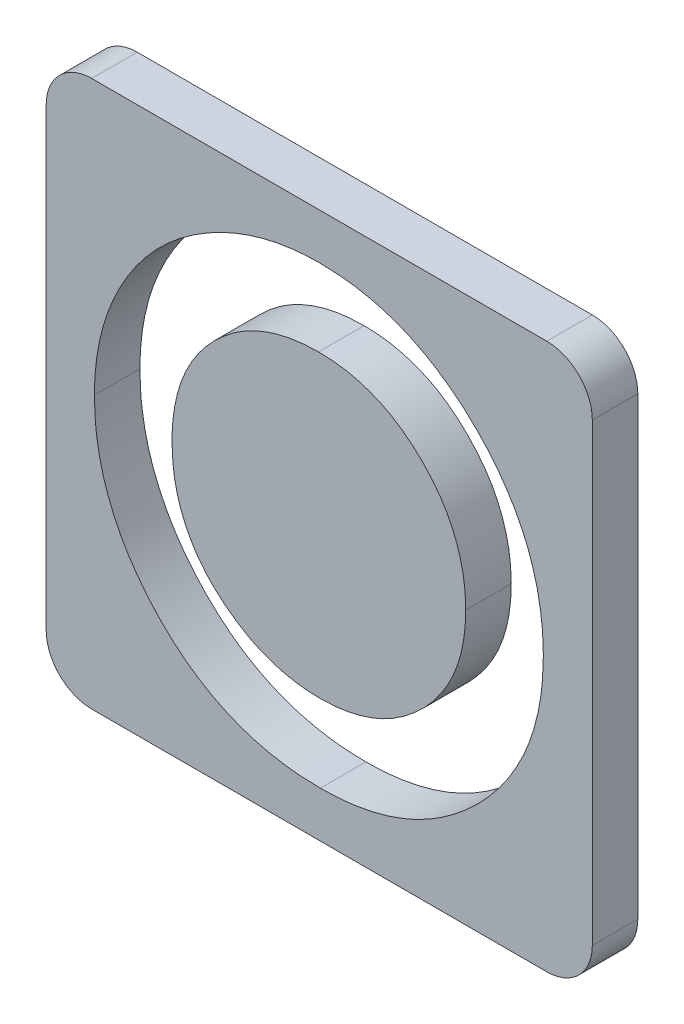
ISO-10303-21;
HEADER;
FILE_DESCRIPTION(('STEP AP214'),'2;1');
FILE_NAME('part.step','',(''),(''),'','','');
FILE_SCHEMA(('AUTOMOTIVE_DESIGN { 1 0 10303 214 1 1 1 1 }'));
ENDSEC;
DATA;
#1=APPLICATION_CONTEXT('core data for automotive mechanical design processes');
#2=APPLICATION_PROTOCOL_DEFINITION('international standard','automotive_design',2000,#1);
#3=PRODUCT_CONTEXT('',#1,'mechanical');
#4=PRODUCT('Part','Part','',(#3));
#5=PRODUCT_RELATED_PRODUCT_CATEGORY('part','',(#4));
#6=PRODUCT_DEFINITION_FORMATION('','',#4);
#7=PRODUCT_DEFINITION_CONTEXT('part definition',#1,'design');
#8=PRODUCT_DEFINITION('design','',#6,#7);
#9=PRODUCT_DEFINITION_SHAPE('','',#8);
#10=(LENGTH_UNIT() NAMED_UNIT(*) SI_UNIT(.MILLI.,.METRE.));
#11=(NAMED_UNIT(*) PLANE_ANGLE_UNIT() SI_UNIT($,.RADIAN.));
#12=(NAMED_UNIT(*) SI_UNIT($,.STERADIAN.) SOLID_ANGLE_UNIT());
#13=UNCERTAINTY_MEASURE_WITH_UNIT(LENGTH_MEASURE(1.E-05),#10,'distance_accuracy_value','');
#14=(GEOMETRIC_REPRESENTATION_CONTEXT(3) GLOBAL_UNCERTAINTY_ASSIGNED_CONTEXT((#13)) GLOBAL_UNIT_ASSIGNED_CONTEXT((#10,
#11,#12)) REPRESENTATION_CONTEXT('',''));
#15=CARTESIAN_POINT('',(0.,0.,0.));
#16=DIRECTION('',(0.,0.,1.));
#17=DIRECTION('',(1.,0.,0.));
#18=AXIS2_PLACEMENT_3D('',#15,#16,#17);
#19=CARTESIAN_POINT('',(50.,50.,10.));
#20=DIRECTION('',(0.,0.,-1.));
#21=DIRECTION('',(-1.,0.,0.));
#22=AXIS2_PLACEMENT_3D('',#19,#20,#21);
#23=PLANE('',#22);
#24=DIRECTION('',(1.,0.,0.));
#25=VECTOR('',#24,1.);
#26=CARTESIAN_POINT('',(-49.9999999999999,60.,10.));
#27=LINE('',#26,#25);
#28=CARTESIAN_POINT('',(-49.9999999999999,60.,10.));
#29=VERTEX_POINT('',#28);
#30=CARTESIAN_POINT('',(49.9999999999999,60.,10.));
#31=VERTEX_POINT('',#30);
#32=EDGE_CURVE('E264',#29,#31,#27,.T.);
#33=ORIENTED_EDGE('',*,*,#32,.F.);
#34=CARTESIAN_POINT('',(-50.,50.,10.));
#35=DIRECTION('',(0.,0.,1.));
#36=DIRECTION('',(1.,0.,0.));
#37=AXIS2_PLACEMENT_3D('',#34,#35,#36);
#38=CIRCLE('',#37,10.);
#39=CARTESIAN_POINT('',(-60.,49.9999999999999,10.));
#40=VERTEX_POINT('',#39);
#41=EDGE_CURVE('E269',#29,#40,#38,.T.);
#42=ORIENTED_EDGE('',*,*,#41,.T.);
#43=DIRECTION('',(0.,-1.,0.));
#44=VECTOR('',#43,1.);
#45=CARTESIAN_POINT('',(-60.,49.9999999999999,10.));
#46=LINE('',#45,#44);
#47=CARTESIAN_POINT('',(-60.,-49.9999999999999,10.));
#48=VERTEX_POINT('',#47);
#49=EDGE_CURVE('E271',#40,#48,#46,.T.);
#50=ORIENTED_EDGE('',*,*,#49,.T.);
#51=CARTESIAN_POINT('',(-50.,-50.,10.));
#52=DIRECTION('',(0.,0.,1.));
#53=DIRECTION('',(1.,0.,0.));
#54=AXIS2_PLACEMENT_3D('',#51,#52,#53);
#55=CIRCLE('',#54,10.);
#56=CARTESIAN_POINT('',(-49.9999999999999,-60.,10.));
#57=VERTEX_POINT('',#56);
#58=EDGE_CURVE('E273',#48,#57,#55,.T.);
#59=ORIENTED_EDGE('',*,*,#58,.T.);
#60=DIRECTION('',(1.,0.,0.));
#61=VECTOR('',#60,1.);
#62=CARTESIAN_POINT('',(-49.9999999999999,-60.,10.));
#63=LINE('',#62,#61);
#64=CARTESIAN_POINT('',(49.9999999999999,-60.,10.));
#65=VERTEX_POINT('',#64);
#66=EDGE_CURVE('E275',#57,#65,#63,.T.);
#67=ORIENTED_EDGE('',*,*,#66,.T.);
#68=CARTESIAN_POINT('',(50.,-50.,10.));
#69=DIRECTION('',(0.,0.,1.));
#70=DIRECTION('',(1.,0.,0.));
#71=AXIS2_PLACEMENT_3D('',#68,#69,#70);
#72=CIRCLE('',#71,10.);
#73=CARTESIAN_POINT('',(60.,-50.,10.));
#74=VERTEX_POINT('',#73);
#75=EDGE_CURVE('E175',#65,#74,#72,.T.);
#76=ORIENTED_EDGE('',*,*,#75,.T.);
#77=DIRECTION('',(0.,-1.,0.));
#78=VECTOR('',#77,1.);
#79=CARTESIAN_POINT('',(60.,49.9999999999999,10.));
#80=LINE('',#79,#78);
#81=CARTESIAN_POINT('',(60.,49.9999999999999,10.));
#82=VERTEX_POINT('',#81);
#83=EDGE_CURVE('E278',#82,#74,#80,.T.);
#84=ORIENTED_EDGE('',*,*,#83,.F.);
#85=CARTESIAN_POINT('',(50.,50.,10.));
#86=DIRECTION('',(0.,0.,-1.));
#87=DIRECTION('',(-1.,0.,0.));
#88=AXIS2_PLACEMENT_3D('',#85,#86,#87);
#89=CIRCLE('',#88,10.);
#90=EDGE_CURVE('E283',#31,#82,#89,.T.);
#91=ORIENTED_EDGE('',*,*,#90,.F.);
#92=EDGE_LOOP('',(#33,#42,#50,#59,#67,#76,#84,#91));
#93=FACE_BOUND('',#92,.T.);
#94=CARTESIAN_POINT('',(-49.4102564102564,0.0380608974358959,10.));
#95=CARTESIAN_POINT('',(-49.3957673905878,1.1617685469443,10.));
#96=CARTESIAN_POINT('',(-49.3669728154704,3.39495512987123,10.));
#97=CARTESIAN_POINT('',(-49.0201118263977,6.70442365191481,10.));
#98=CARTESIAN_POINT('',(-48.5207317275487,9.94929579175007,10.));
#99=CARTESIAN_POINT('',(-47.7821722565631,13.1166341969936,10.));
#100=CARTESIAN_POINT('',(-46.8850112673752,16.2287829672669,10.));
#101=CARTESIAN_POINT('',(-45.722612472409,19.2567734509904,10.));
#102=CARTESIAN_POINT('',(-44.3994880710342,22.2329529137583,10.));
#103=CARTESIAN_POINT('',(-42.8535417852491,25.1221689493868,10.));
#104=CARTESIAN_POINT('',(-41.1345989954782,27.8978383560074,10.));
#105=CARTESIAN_POINT('',(-39.2590793696147,30.5468678164809,10.));
#106=CARTESIAN_POINT('',(-37.2222669390619,33.0372266921079,10.));
#107=CARTESIAN_POINT('',(-35.0307229514111,35.3852805957061,10.));
#108=CARTESIAN_POINT('',(-32.6768950493374,37.5755955985026,10.));
#109=CARTESIAN_POINT('',(-30.1917454075254,39.6391786588103,10.));
#110=CARTESIAN_POINT('',(-27.5270765932554,41.5212136730233,10.));
#111=CARTESIAN_POINT('',(-24.7412098463414,43.2676636898961,10.));
#112=CARTESIAN_POINT('',(-21.8498512428264,44.846948152451,10.));
#113=CARTESIAN_POINT('',(-18.8647712349628,46.1911878553042,9.99999999999999));
#114=CARTESIAN_POINT('',(-15.8474683677357,47.3650894910034,10.));
#115=CARTESIAN_POINT('',(-12.7576355441757,48.2915845676623,10.));
#116=CARTESIAN_POINT('',(-9.62838581927368,49.046205114471,10.));
#117=CARTESIAN_POINT('',(-6.42628949849059,49.5452486313514,10.));
#118=CARTESIAN_POINT('',(-3.18027570171302,49.8921000148372,10.));
#119=CARTESIAN_POINT('',(-0.991378229263571,49.9212636488662,10.));
#120=CARTESIAN_POINT('',(0.106971153846155,49.9358974358974,10.));
#121=B_SPLINE_CURVE_WITH_KNOTS('',3,(#94,#95,#96,#97,#98,#99,#100,#101,#102,#103,#104,#105,#106,
#107,#108,#109,#110,#111,#112,#113,#114,#115,#116,#117,#118,#119,#120),.UNSPECIFIED.,.F.,.F.,(4,
1,1,1,1,1,1,1,1,1,1,1,1,1,1,1,1,1,1,1,1,1,1,1,4),(0.,0.0431143456619736,0.0856827648242091,
0.127594324163927,0.169058622560548,0.21043202882131,0.251811166463053,0.293443839798239,
0.335380853221825,0.377476605960794,0.418688490676827,0.459873033671199,0.500872904625315,
0.541872775579432,0.583211776867324,0.624763201734076,0.666987622382089,0.709369705894239,
0.751102651944858,0.792568380120221,0.833545108550258,0.874827422556526,0.916017723211067,
0.957859203976305,1.),.UNSPECIFIED.);
#122=CARTESIAN_POINT('',(-49.4102564102564,0.0380608974358959,10.));
#123=VERTEX_POINT('',#122);
#124=CARTESIAN_POINT('',(0.106971153846155,49.9358974358974,10.));
#125=VERTEX_POINT('',#124);
#126=EDGE_CURVE('E90',#123,#125,#121,.T.);
#127=ORIENTED_EDGE('',*,*,#126,.T.);
#128=CARTESIAN_POINT('',(0.106971153846155,49.9358974358974,10.));
#129=CARTESIAN_POINT('',(1.75866258223979,49.89313218698,10.));
#130=CARTESIAN_POINT('',(5.01947556295759,49.8087038994705,10.));
#131=CARTESIAN_POINT('',(9.81495475203649,49.1049282300409,10.));
#132=CARTESIAN_POINT('',(14.4362856316943,47.9582266725385,10.));
#133=CARTESIAN_POINT('',(18.8813784494052,46.3642285673853,10.));
#134=CARTESIAN_POINT('',(23.139103203726,44.2797603455363,10.));
#135=CARTESIAN_POINT('',(27.2244783154098,41.7639180487764,10.));
#136=CARTESIAN_POINT('',(31.1228701644353,38.769216661042,10.));
#137=CARTESIAN_POINT('',(34.7943311570669,35.3655176250855,10.));
#138=CARTESIAN_POINT('',(38.1874232758517,31.664143544938,10.));
#139=CARTESIAN_POINT('',(41.1275395785458,27.6789562951129,10.));
#140=CARTESIAN_POINT('',(43.6347628999377,23.5132160806287,10.));
#141=CARTESIAN_POINT('',(45.7127562966981,19.1557606791591,10.));
#142=CARTESIAN_POINT('',(47.295535047718,14.5764126340281,10.));
#143=CARTESIAN_POINT('',(48.4062363644552,9.79852056758408,10.));
#144=CARTESIAN_POINT('',(49.119806932273,4.82344374644431,10.));
#145=CARTESIAN_POINT('',(49.2018785266101,1.43609454170056,10.));
#146=CARTESIAN_POINT('',(49.2435897435897,-0.285456730769226,10.));
#147=B_SPLINE_CURVE_WITH_KNOTS('',3,(#128,#129,#130,#131,#132,#133,#134,#135,#136,#137,#138,
#139,#140,#141,#142,#143,#144,#145,#146),.UNSPECIFIED.,.F.,.F.,(4,1,1,1,1,1,1,1,1,1,1,1,1,1,1,1,
4),(0.,0.0633955966615904,0.125157266642421,0.185649466526253,0.245976679340815,
0.306108368657957,0.367350588089175,0.429902078279914,0.494539958183194,0.559372582694048,
0.622409685845737,0.684357425819475,0.74580660077221,0.807430275015915,0.869995516069782,
0.933927867719273,1.),.UNSPECIFIED.);
#148=CARTESIAN_POINT('',(49.2435897435897,-0.285456730769226,10.));
#149=VERTEX_POINT('',#148);
#150=EDGE_CURVE('E80',#125,#149,#147,.T.);
#151=ORIENTED_EDGE('',*,*,#150,.T.);
#152=CARTESIAN_POINT('',(49.2435897435897,-0.285456730769226,10.));
#153=CARTESIAN_POINT('',(49.1991691023123,-1.98761009659369,10.));
#154=CARTESIAN_POINT('',(49.1116368034948,-5.34175791539525,10.));
#155=CARTESIAN_POINT('',(48.435367438689,-10.2709874443335,10.));
#156=CARTESIAN_POINT('',(47.3059617725432,-14.9976983321195,10.));
#157=CARTESIAN_POINT('',(45.7500281911789,-19.5325895951509,10.));
#158=CARTESIAN_POINT('',(43.7097217384712,-23.8536957766879,10.));
#159=CARTESIAN_POINT('',(41.2513920018967,-27.9886065377063,10.));
#160=CARTESIAN_POINT('',(38.3101683329392,-31.8989489169845,10.));
#161=CARTESIAN_POINT('',(34.9933287096222,-35.5826244760669,10.));
#162=CARTESIAN_POINT('',(31.3417761309501,-38.9263504765429,10.));
#163=CARTESIAN_POINT('',(27.4742022743858,-41.8730032399916,10.));
#164=CARTESIAN_POINT('',(23.408465205639,-44.3698855927531,10.));
#165=CARTESIAN_POINT('',(19.1505158666614,-46.4158538417511,10.));
#166=CARTESIAN_POINT('',(14.6912232893291,-48.0036544513869,10.));
#167=CARTESIAN_POINT('',(10.0416024715523,-49.123963156587,10.));
#168=CARTESIAN_POINT('',(5.20194113037205,-49.8047973780126,10.));
#169=CARTESIAN_POINT('',(1.91073671987994,-49.891757925059,10.));
#170=CARTESIAN_POINT('',(0.240184294871798,-49.9358974358974,10.));
#171=B_SPLINE_CURVE_WITH_KNOTS('',3,(#152,#153,#154,#155,#156,#157,#158,#159,#160,#161,#162,
#163,#164,#165,#166,#167,#168,#169,#170),.UNSPECIFIED.,.F.,.F.,(4,1,1,1,1,1,1,1,1,1,1,1,1,1,1,1,
4),(0.,0.0657223151915616,0.129507930702584,0.191722102692161,0.253161124502089,
0.314315703735257,0.375951739772862,0.438619600823409,0.502972901892777,0.567128645724265,
0.629552289579674,0.690476782434874,0.751072338410829,0.811667894386783,0.872929355587391,
0.935501370715807,1.),.UNSPECIFIED.);
#172=CARTESIAN_POINT('',(0.240184294871798,-49.9358974358974,10.));
#173=VERTEX_POINT('',#172);
#174=EDGE_CURVE('E147',#149,#173,#171,.T.);
#175=ORIENTED_EDGE('',*,*,#174,.T.);
#176=CARTESIAN_POINT('',(0.240184294871798,-49.9358974358974,10.));
#177=CARTESIAN_POINT('',(-1.50701323401463,-49.8963021190555,10.));
#178=CARTESIAN_POINT('',(-4.94001755752694,-49.8185027336616,10.));
#179=CARTESIAN_POINT('',(-9.96423475322915,-49.078666096082,10.));
#180=CARTESIAN_POINT('',(-14.7778689555149,-47.9642136733102,10.));
#181=CARTESIAN_POINT('',(-19.3404828653858,-46.3009532187965,10.));
#182=CARTESIAN_POINT('',(-23.6985428056991,-44.2217377925862,10.));
#183=CARTESIAN_POINT('',(-27.8200288302264,-41.6610593381173,10.));
#184=CARTESIAN_POINT('',(-31.7035558493577,-38.6231495743,10.));
#185=CARTESIAN_POINT('',(-35.3268473154687,-35.1858104982212,10.));
#186=CARTESIAN_POINT('',(-38.6095581585327,-31.4246076267552,10.));
#187=CARTESIAN_POINT('',(-41.5071943836964,-27.451230332802,10.));
#188=CARTESIAN_POINT('',(-43.9514148185676,-23.2960317246603,9.99999999999999));
#189=CARTESIAN_POINT('',(-45.9423088924062,-18.9570670811899,10.));
#190=CARTESIAN_POINT('',(-47.5118498043688,-14.4613020116144,10.));
#191=CARTESIAN_POINT('',(-48.6189825861533,-9.78135600965341,10.));
#192=CARTESIAN_POINT('',(-49.2729923398744,-4.92845328489871,10.));
#193=CARTESIAN_POINT('',(-49.3640921010548,-1.63226474371458,10.));
#194=CARTESIAN_POINT('',(-49.4102564102564,0.0380608974358959,10.));
#195=B_SPLINE_CURVE_WITH_KNOTS('',3,(#176,#177,#178,#179,#180,#181,#182,#183,#184,#185,#186,
#187,#188,#189,#190,#191,#192,#193,#194),.UNSPECIFIED.,.F.,.F.,(4,1,1,1,1,1,1,1,1,1,1,1,1,1,1,1,
4),(0.,0.0667486513092664,0.131151976090176,0.193732197057096,0.255325543378599,
0.316388185777386,0.378026862906887,0.440405679205402,0.504557429324081,0.568658287362015,
0.63098617909001,0.692288134873299,0.752615446979639,0.813199538435563,0.874016124860782,
0.936158355510531,1.),.UNSPECIFIED.);
#196=EDGE_CURVE('E152',#173,#123,#195,.T.);
#197=ORIENTED_EDGE('',*,*,#196,.T.);
#198=EDGE_LOOP('',(#127,#151,#175,#197));
#199=FACE_BOUND('',#198,.T.);
#200=ADVANCED_FACE('F43',(#93,#199),#23,.F.);
#201=CARTESIAN_POINT('',(50.,50.,0.));
#202=DIRECTION('',(0.,0.,-1.));
#203=DIRECTION('',(-1.,0.,0.));
#204=AXIS2_PLACEMENT_3D('',#201,#202,#203);
#205=PLANE('',#204);
#206=DIRECTION('',(1.,0.,0.));
#207=VECTOR('',#206,1.);
#208=CARTESIAN_POINT('',(-49.9999999999999,60.,0.));
#209=LINE('',#208,#207);
#210=CARTESIAN_POINT('',(-49.9999999999999,60.,0.));
#211=VERTEX_POINT('',#210);
#212=CARTESIAN_POINT('',(49.9999999999999,60.,0.));
#213=VERTEX_POINT('',#212);
#214=EDGE_CURVE('E155',#211,#213,#209,.T.);
#215=ORIENTED_EDGE('',*,*,#214,.T.);
#216=CARTESIAN_POINT('',(50.,50.,0.));
#217=DIRECTION('',(0.,0.,-1.));
#218=DIRECTION('',(-1.,0.,0.));
#219=AXIS2_PLACEMENT_3D('',#216,#217,#218);
#220=CIRCLE('',#219,10.);
#221=CARTESIAN_POINT('',(60.,49.9999999999999,0.));
#222=VERTEX_POINT('',#221);
#223=EDGE_CURVE('E255',#213,#222,#220,.T.);
#224=ORIENTED_EDGE('',*,*,#223,.T.);
#225=DIRECTION('',(0.,-1.,0.));
#226=VECTOR('',#225,1.);
#227=CARTESIAN_POINT('',(60.,49.9999999999999,0.));
#228=LINE('',#227,#226);
#229=CARTESIAN_POINT('',(60.,-50.,0.));
#230=VERTEX_POINT('',#229);
#231=EDGE_CURVE('E262',#222,#230,#228,.T.);
#232=ORIENTED_EDGE('',*,*,#231,.T.);
#233=CARTESIAN_POINT('',(50.,-50.,0.));
#234=DIRECTION('',(0.,0.,1.));
#235=DIRECTION('',(1.,0.,0.));
#236=AXIS2_PLACEMENT_3D('',#233,#234,#235);
#237=CIRCLE('',#236,10.);
#238=CARTESIAN_POINT('',(49.9999999999999,-60.,0.));
#239=VERTEX_POINT('',#238);
#240=EDGE_CURVE('E296',#239,#230,#237,.T.);
#241=ORIENTED_EDGE('',*,*,#240,.F.);
#242=DIRECTION('',(1.,0.,0.));
#243=VECTOR('',#242,1.);
#244=CARTESIAN_POINT('',(-49.9999999999999,-60.,0.));
#245=LINE('',#244,#243);
#246=CARTESIAN_POINT('',(-49.9999999999999,-60.,0.));
#247=VERTEX_POINT('',#246);
#248=EDGE_CURVE('E300',#247,#239,#245,.T.);
#249=ORIENTED_EDGE('',*,*,#248,.F.);
#250=CARTESIAN_POINT('',(-50.,-50.,0.));
#251=DIRECTION('',(0.,0.,1.));
#252=DIRECTION('',(1.,0.,0.));
#253=AXIS2_PLACEMENT_3D('',#250,#251,#252);
#254=CIRCLE('',#253,10.);
#255=CARTESIAN_POINT('',(-60.,-49.9999999999999,0.));
#256=VERTEX_POINT('',#255);
#257=EDGE_CURVE('E304',#256,#247,#254,.T.);
#258=ORIENTED_EDGE('',*,*,#257,.F.);
#259=DIRECTION('',(0.,-1.,0.));
#260=VECTOR('',#259,1.);
#261=CARTESIAN_POINT('',(-60.,49.9999999999999,0.));
#262=LINE('',#261,#260);
#263=CARTESIAN_POINT('',(-60.,49.9999999999999,0.));
#264=VERTEX_POINT('',#263);
#265=EDGE_CURVE('E308',#264,#256,#262,.T.);
#266=ORIENTED_EDGE('',*,*,#265,.F.);
#267=CARTESIAN_POINT('',(-50.,50.,0.));
#268=DIRECTION('',(0.,0.,1.));
#269=DIRECTION('',(1.,0.,0.));
#270=AXIS2_PLACEMENT_3D('',#267,#268,#269);
#271=CIRCLE('',#270,10.);
#272=EDGE_CURVE('E287',#211,#264,#271,.T.);
#273=ORIENTED_EDGE('',*,*,#272,.F.);
#274=EDGE_LOOP('',(#215,#224,#232,#241,#249,#258,#266,#273));
#275=FACE_BOUND('',#274,.T.);
#276=CARTESIAN_POINT('',(0.106971153846155,49.9358974358974,0.));
#277=CARTESIAN_POINT('',(1.75866258223979,49.89313218698,0.));
#278=CARTESIAN_POINT('',(5.01947556295759,49.8087038994705,0.));
#279=CARTESIAN_POINT('',(9.81495475203649,49.1049282300409,0.));
#280=CARTESIAN_POINT('',(14.4362856316943,47.9582266725385,0.));
#281=CARTESIAN_POINT('',(18.8813784494052,46.3642285673853,0.));
#282=CARTESIAN_POINT('',(23.139103203726,44.2797603455363,0.));
#283=CARTESIAN_POINT('',(27.2244783154098,41.7639180487764,0.));
#284=CARTESIAN_POINT('',(31.1228701644353,38.769216661042,0.));
#285=CARTESIAN_POINT('',(34.7943311570669,35.3655176250855,0.));
#286=CARTESIAN_POINT('',(38.1874232758517,31.664143544938,0.));
#287=CARTESIAN_POINT('',(41.1275395785458,27.6789562951129,0.));
#288=CARTESIAN_POINT('',(43.6347628999377,23.5132160806287,0.));
#289=CARTESIAN_POINT('',(45.7127562966981,19.1557606791591,0.));
#290=CARTESIAN_POINT('',(47.295535047718,14.5764126340281,0.));
#291=CARTESIAN_POINT('',(48.4062363644552,9.79852056758408,0.));
#292=CARTESIAN_POINT('',(49.119806932273,4.82344374644431,0.));
#293=CARTESIAN_POINT('',(49.2018785266101,1.43609454170056,0.));
#294=CARTESIAN_POINT('',(49.2435897435897,-0.285456730769226,0.));
#295=B_SPLINE_CURVE_WITH_KNOTS('',3,(#276,#277,#278,#279,#280,#281,#282,#283,#284,#285,#286,
#287,#288,#289,#290,#291,#292,#293,#294),.UNSPECIFIED.,.F.,.F.,(4,1,1,1,1,1,1,1,1,1,1,1,1,1,1,1,
4),(0.,0.0633955966615904,0.125157266642421,0.185649466526253,0.245976679340815,
0.306108368657957,0.367350588089175,0.429902078279914,0.494539958183194,0.559372582694048,
0.622409685845737,0.684357425819475,0.74580660077221,0.807430275015915,0.869995516069782,
0.933927867719273,1.),.UNSPECIFIED.);
#296=CARTESIAN_POINT('',(0.106971153846155,49.9358974358974,0.));
#297=VERTEX_POINT('',#296);
#298=CARTESIAN_POINT('',(49.2435897435897,-0.285456730769226,0.));
#299=VERTEX_POINT('',#298);
#300=EDGE_CURVE('E76',#297,#299,#295,.T.);
#301=ORIENTED_EDGE('',*,*,#300,.F.);
#302=CARTESIAN_POINT('',(-49.4102564102564,0.0380608974358959,0.));
#303=CARTESIAN_POINT('',(-49.3957673905878,1.1617685469443,0.));
#304=CARTESIAN_POINT('',(-49.3669728154704,3.39495512987123,0.));
#305=CARTESIAN_POINT('',(-49.0201118263977,6.70442365191481,0.));
#306=CARTESIAN_POINT('',(-48.5207317275487,9.94929579175007,0.));
#307=CARTESIAN_POINT('',(-47.7821722565631,13.1166341969936,0.));
#308=CARTESIAN_POINT('',(-46.8850112673752,16.2287829672669,0.));
#309=CARTESIAN_POINT('',(-45.722612472409,19.2567734509904,0.));
#310=CARTESIAN_POINT('',(-44.3994880710342,22.2329529137583,0.));
#311=CARTESIAN_POINT('',(-42.8535417852491,25.1221689493868,0.));
#312=CARTESIAN_POINT('',(-41.1345989954782,27.8978383560074,0.));
#313=CARTESIAN_POINT('',(-39.2590793696147,30.5468678164809,0.));
#314=CARTESIAN_POINT('',(-37.2222669390619,33.0372266921079,0.));
#315=CARTESIAN_POINT('',(-35.0307229514111,35.3852805957061,0.));
#316=CARTESIAN_POINT('',(-32.6768950493374,37.5755955985026,0.));
#317=CARTESIAN_POINT('',(-30.1917454075254,39.6391786588103,0.));
#318=CARTESIAN_POINT('',(-27.5270765932554,41.5212136730233,0.));
#319=CARTESIAN_POINT('',(-24.7412098463414,43.2676636898961,0.));
#320=CARTESIAN_POINT('',(-21.8498512428264,44.846948152451,0.));
#321=CARTESIAN_POINT('',(-18.8647712349628,46.1911878553042,0.));
#322=CARTESIAN_POINT('',(-15.8474683677357,47.3650894910034,0.));
#323=CARTESIAN_POINT('',(-12.7576355441757,48.2915845676623,0.));
#324=CARTESIAN_POINT('',(-9.62838581927368,49.046205114471,0.));
#325=CARTESIAN_POINT('',(-6.42628949849059,49.5452486313514,0.));
#326=CARTESIAN_POINT('',(-3.18027570171302,49.8921000148372,0.));
#327=CARTESIAN_POINT('',(-0.991378229263571,49.9212636488662,0.));
#328=CARTESIAN_POINT('',(0.106971153846155,49.9358974358974,0.));
#329=B_SPLINE_CURVE_WITH_KNOTS('',3,(#302,#303,#304,#305,#306,#307,#308,#309,#310,#311,#312,
#313,#314,#315,#316,#317,#318,#319,#320,#321,#322,#323,#324,#325,#326,#327,#328),.UNSPECIFIED.,
.F.,.F.,(4,1,1,1,1,1,1,1,1,1,1,1,1,1,1,1,1,1,1,1,1,1,1,1,4),(0.,0.0431143456619736,
0.0856827648242091,0.127594324163927,0.169058622560548,0.21043202882131,0.251811166463053,
0.293443839798239,0.335380853221825,0.377476605960794,0.418688490676827,0.459873033671199,
0.500872904625315,0.541872775579432,0.583211776867324,0.624763201734076,0.666987622382089,
0.709369705894239,0.751102651944858,0.792568380120221,0.833545108550258,0.874827422556526,
0.916017723211067,0.957859203976305,1.),.UNSPECIFIED.);
#330=CARTESIAN_POINT('',(-49.4102564102564,0.0380608974358959,0.));
#331=VERTEX_POINT('',#330);
#332=EDGE_CURVE('E46',#331,#297,#329,.T.);
#333=ORIENTED_EDGE('',*,*,#332,.F.);
#334=CARTESIAN_POINT('',(0.240184294871798,-49.9358974358974,0.));
#335=CARTESIAN_POINT('',(-1.50701323401463,-49.8963021190555,0.));
#336=CARTESIAN_POINT('',(-4.94001755752694,-49.8185027336616,0.));
#337=CARTESIAN_POINT('',(-9.96423475322915,-49.078666096082,0.));
#338=CARTESIAN_POINT('',(-14.7778689555149,-47.9642136733102,0.));
#339=CARTESIAN_POINT('',(-19.3404828653858,-46.3009532187965,0.));
#340=CARTESIAN_POINT('',(-23.6985428056991,-44.2217377925862,0.));
#341=CARTESIAN_POINT('',(-27.8200288302264,-41.6610593381173,0.));
#342=CARTESIAN_POINT('',(-31.7035558493577,-38.6231495743,0.));
#343=CARTESIAN_POINT('',(-35.3268473154687,-35.1858104982212,0.));
#344=CARTESIAN_POINT('',(-38.6095581585327,-31.4246076267552,0.));
#345=CARTESIAN_POINT('',(-41.5071943836964,-27.451230332802,0.));
#346=CARTESIAN_POINT('',(-43.9514148185676,-23.2960317246603,0.));
#347=CARTESIAN_POINT('',(-45.9423088924062,-18.9570670811899,0.));
#348=CARTESIAN_POINT('',(-47.5118498043688,-14.4613020116144,0.));
#349=CARTESIAN_POINT('',(-48.6189825861533,-9.78135600965341,0.));
#350=CARTESIAN_POINT('',(-49.2729923398744,-4.92845328489871,0.));
#351=CARTESIAN_POINT('',(-49.3640921010548,-1.63226474371458,0.));
#352=CARTESIAN_POINT('',(-49.4102564102564,0.0380608974358959,0.));
#353=B_SPLINE_CURVE_WITH_KNOTS('',3,(#334,#335,#336,#337,#338,#339,#340,#341,#342,#343,#344,
#345,#346,#347,#348,#349,#350,#351,#352),.UNSPECIFIED.,.F.,.F.,(4,1,1,1,1,1,1,1,1,1,1,1,1,1,1,1,
4),(0.,0.0667486513092664,0.131151976090176,0.193732197057096,0.255325543378599,
0.316388185777386,0.378026862906887,0.440405679205402,0.504557429324081,0.568658287362015,
0.63098617909001,0.692288134873299,0.752615446979639,0.813199538435563,0.874016124860782,
0.936158355510531,1.),.UNSPECIFIED.);
#354=CARTESIAN_POINT('',(0.240184294871798,-49.9358974358974,0.));
#355=VERTEX_POINT('',#354);
#356=EDGE_CURVE('E55',#355,#331,#353,.T.);
#357=ORIENTED_EDGE('',*,*,#356,.F.);
#358=CARTESIAN_POINT('',(49.2435897435897,-0.285456730769226,0.));
#359=CARTESIAN_POINT('',(49.1991691023123,-1.98761009659369,0.));
#360=CARTESIAN_POINT('',(49.1116368034948,-5.34175791539525,0.));
#361=CARTESIAN_POINT('',(48.435367438689,-10.2709874443335,0.));
#362=CARTESIAN_POINT('',(47.3059617725432,-14.9976983321195,0.));
#363=CARTESIAN_POINT('',(45.7500281911789,-19.5325895951509,0.));
#364=CARTESIAN_POINT('',(43.7097217384712,-23.8536957766879,0.));
#365=CARTESIAN_POINT('',(41.2513920018967,-27.9886065377063,0.));
#366=CARTESIAN_POINT('',(38.3101683329392,-31.8989489169845,0.));
#367=CARTESIAN_POINT('',(34.9933287096222,-35.5826244760669,0.));
#368=CARTESIAN_POINT('',(31.3417761309501,-38.9263504765429,0.));
#369=CARTESIAN_POINT('',(27.4742022743858,-41.8730032399916,0.));
#370=CARTESIAN_POINT('',(23.408465205639,-44.3698855927531,0.));
#371=CARTESIAN_POINT('',(19.1505158666614,-46.4158538417511,0.));
#372=CARTESIAN_POINT('',(14.6912232893291,-48.0036544513869,0.));
#373=CARTESIAN_POINT('',(10.0416024715523,-49.123963156587,0.));
#374=CARTESIAN_POINT('',(5.20194113037205,-49.8047973780126,0.));
#375=CARTESIAN_POINT('',(1.91073671987994,-49.891757925059,0.));
#376=CARTESIAN_POINT('',(0.240184294871798,-49.9358974358974,0.));
#377=B_SPLINE_CURVE_WITH_KNOTS('',3,(#358,#359,#360,#361,#362,#363,#364,#365,#366,#367,#368,
#369,#370,#371,#372,#373,#374,#375,#376),.UNSPECIFIED.,.F.,.F.,(4,1,1,1,1,1,1,1,1,1,1,1,1,1,1,1,
4),(0.,0.0657223151915616,0.129507930702584,0.191722102692161,0.253161124502089,
0.314315703735257,0.375951739772862,0.438619600823409,0.502972901892777,0.567128645724265,
0.629552289579674,0.690476782434874,0.751072338410829,0.811667894386783,0.872929355587391,
0.935501370715807,1.),.UNSPECIFIED.);
#378=EDGE_CURVE('E149',#299,#355,#377,.T.);
#379=ORIENTED_EDGE('',*,*,#378,.F.);
#380=EDGE_LOOP('',(#301,#333,#357,#379));
#381=FACE_BOUND('',#380,.T.);
#382=ADVANCED_FACE('F193',(#275,#381),#205,.T.);
#383=CARTESIAN_POINT('',(-49.9999999999999,60.,10.));
#384=DIRECTION('',(0.,1.,0.));
#385=DIRECTION('',(0.,0.,1.));
#386=AXIS2_PLACEMENT_3D('',#383,#384,#385);
#387=PLANE('',#386);
#388=ORIENTED_EDGE('',*,*,#214,.F.);
#389=DIRECTION('',(0.,0.,-1.));
#390=VECTOR('',#389,1.);
#391=CARTESIAN_POINT('',(-49.9999999999999,60.,10.));
#392=LINE('',#391,#390);
#393=EDGE_CURVE('E289',#29,#211,#392,.T.);
#394=ORIENTED_EDGE('',*,*,#393,.F.);
#395=ORIENTED_EDGE('',*,*,#32,.T.);
#396=DIRECTION('',(0.,0.,-1.));
#397=VECTOR('',#396,1.);
#398=CARTESIAN_POINT('',(49.9999999999999,60.,10.));
#399=LINE('',#398,#397);
#400=EDGE_CURVE('E257',#31,#213,#399,.T.);
#401=ORIENTED_EDGE('',*,*,#400,.T.);
#402=EDGE_LOOP('',(#388,#394,#395,#401));
#403=FACE_BOUND('',#402,.T.);
#404=ADVANCED_FACE('F195',(#403),#387,.T.);
#405=CARTESIAN_POINT('',(-50.,50.,10.));
#406=DIRECTION('',(0.,0.,-1.));
#407=DIRECTION('',(-1.,0.,0.));
#408=AXIS2_PLACEMENT_3D('',#405,#406,#407);
#409=CYLINDRICAL_SURFACE('',#408,10.);
#410=ORIENTED_EDGE('',*,*,#272,.T.);
#411=DIRECTION('',(0.,0.,-1.));
#412=VECTOR('',#411,1.);
#413=CARTESIAN_POINT('',(-60.,49.9999999999999,10.));
#414=LINE('',#413,#412);
#415=EDGE_CURVE('E305',#40,#264,#414,.T.);
#416=ORIENTED_EDGE('',*,*,#415,.F.);
#417=ORIENTED_EDGE('',*,*,#41,.F.);
#418=ORIENTED_EDGE('',*,*,#393,.T.);
#419=EDGE_LOOP('',(#410,#416,#417,#418));
#420=FACE_BOUND('',#419,.T.);
#421=ADVANCED_FACE('F201',(#420),#409,.T.);
#422=CARTESIAN_POINT('',(-60.,49.9999999999999,10.));
#423=DIRECTION('',(1.,0.,0.));
#424=DIRECTION('',(0.,1.,0.));
#425=AXIS2_PLACEMENT_3D('',#422,#423,#424);
#426=PLANE('',#425);
#427=ORIENTED_EDGE('',*,*,#265,.T.);
#428=DIRECTION('',(0.,0.,-1.));
#429=VECTOR('',#428,1.);
#430=CARTESIAN_POINT('',(-60.,-49.9999999999999,10.));
#431=LINE('',#430,#429);
#432=EDGE_CURVE('E301',#48,#256,#431,.T.);
#433=ORIENTED_EDGE('',*,*,#432,.F.);
#434=ORIENTED_EDGE('',*,*,#49,.F.);
#435=ORIENTED_EDGE('',*,*,#415,.T.);
#436=EDGE_LOOP('',(#427,#433,#434,#435));
#437=FACE_BOUND('',#436,.T.);
#438=ADVANCED_FACE('F229',(#437),#426,.F.);
#439=CARTESIAN_POINT('',(-50.,-50.,10.));
#440=DIRECTION('',(0.,0.,-1.));
#441=DIRECTION('',(-1.,0.,0.));
#442=AXIS2_PLACEMENT_3D('',#439,#440,#441);
#443=CYLINDRICAL_SURFACE('',#442,10.);
#444=ORIENTED_EDGE('',*,*,#257,.T.);
#445=DIRECTION('',(0.,0.,-1.));
#446=VECTOR('',#445,1.);
#447=CARTESIAN_POINT('',(-49.9999999999999,-60.,10.));
#448=LINE('',#447,#446);
#449=EDGE_CURVE('E297',#57,#247,#448,.T.);
#450=ORIENTED_EDGE('',*,*,#449,.F.);
#451=ORIENTED_EDGE('',*,*,#58,.F.);
#452=ORIENTED_EDGE('',*,*,#432,.T.);
#453=EDGE_LOOP('',(#444,#450,#451,#452));
#454=FACE_BOUND('',#453,.T.);
#455=ADVANCED_FACE('F233',(#454),#443,.T.);
#456=CARTESIAN_POINT('',(-49.9999999999999,-60.,10.));
#457=DIRECTION('',(0.,1.,0.));
#458=DIRECTION('',(0.,0.,1.));
#459=AXIS2_PLACEMENT_3D('',#456,#457,#458);
#460=PLANE('',#459);
#461=ORIENTED_EDGE('',*,*,#248,.T.);
#462=DIRECTION('',(0.,0.,-1.));
#463=VECTOR('',#462,1.);
#464=CARTESIAN_POINT('',(49.9999999999999,-60.,10.));
#465=LINE('',#464,#463);
#466=EDGE_CURVE('E282',#65,#239,#465,.T.);
#467=ORIENTED_EDGE('',*,*,#466,.F.);
#468=ORIENTED_EDGE('',*,*,#66,.F.);
#469=ORIENTED_EDGE('',*,*,#449,.T.);
#470=EDGE_LOOP('',(#461,#467,#468,#469));
#471=FACE_BOUND('',#470,.T.);
#472=ADVANCED_FACE('F237',(#471),#460,.F.);
#473=CARTESIAN_POINT('',(50.,-50.,10.));
#474=DIRECTION('',(0.,0.,-1.));
#475=DIRECTION('',(-1.,0.,0.));
#476=AXIS2_PLACEMENT_3D('',#473,#474,#475);
#477=CYLINDRICAL_SURFACE('',#476,10.);
#478=ORIENTED_EDGE('',*,*,#240,.T.);
#479=DIRECTION('',(0.,0.,-1.));
#480=VECTOR('',#479,1.);
#481=CARTESIAN_POINT('',(60.,-50.,10.));
#482=LINE('',#481,#480);
#483=EDGE_CURVE('E281',#74,#230,#482,.T.);
#484=ORIENTED_EDGE('',*,*,#483,.F.);
#485=ORIENTED_EDGE('',*,*,#75,.F.);
#486=ORIENTED_EDGE('',*,*,#466,.T.);
#487=EDGE_LOOP('',(#478,#484,#485,#486));
#488=FACE_BOUND('',#487,.T.);
#489=ADVANCED_FACE('F241',(#488),#477,.T.);
#490=CARTESIAN_POINT('',(60.,49.9999999999999,10.));
#491=DIRECTION('',(1.,0.,0.));
#492=DIRECTION('',(0.,1.,0.));
#493=AXIS2_PLACEMENT_3D('',#490,#491,#492);
#494=PLANE('',#493);
#495=ORIENTED_EDGE('',*,*,#231,.F.);
#496=DIRECTION('',(0.,0.,-1.));
#497=VECTOR('',#496,1.);
#498=CARTESIAN_POINT('',(60.,49.9999999999999,10.));
#499=LINE('',#498,#497);
#500=EDGE_CURVE('E259',#82,#222,#499,.T.);
#501=ORIENTED_EDGE('',*,*,#500,.F.);
#502=ORIENTED_EDGE('',*,*,#83,.T.);
#503=ORIENTED_EDGE('',*,*,#483,.T.);
#504=EDGE_LOOP('',(#495,#501,#502,#503));
#505=FACE_BOUND('',#504,.T.);
#506=ADVANCED_FACE('F245',(#505),#494,.T.);
#507=CARTESIAN_POINT('',(50.,50.,10.));
#508=DIRECTION('',(0.,0.,-1.));
#509=DIRECTION('',(-1.,0.,0.));
#510=AXIS2_PLACEMENT_3D('',#507,#508,#509);
#511=CYLINDRICAL_SURFACE('',#510,10.);
#512=ORIENTED_EDGE('',*,*,#223,.F.);
#513=ORIENTED_EDGE('',*,*,#400,.F.);
#514=ORIENTED_EDGE('',*,*,#90,.T.);
#515=ORIENTED_EDGE('',*,*,#500,.T.);
#516=EDGE_LOOP('',(#512,#513,#514,#515));
#517=FACE_BOUND('',#516,.T.);
#518=ADVANCED_FACE('F226',(#517),#511,.T.);
#519=DIRECTION('',(0.,0.,1.));
#520=VECTOR('',#519,1.);
#521=SURFACE_OF_LINEAR_EXTRUSION('',#329,#520);
#522=ORIENTED_EDGE('',*,*,#126,.F.);
#523=DIRECTION('',(0.,0.,1.));
#524=VECTOR('',#523,1.);
#525=CARTESIAN_POINT('',(-49.4102564102564,0.0380608974358959,0.));
#526=LINE('',#525,#524);
#527=EDGE_CURVE('E12',#331,#123,#526,.T.);
#528=ORIENTED_EDGE('',*,*,#527,.F.);
#529=ORIENTED_EDGE('',*,*,#332,.T.);
#530=DIRECTION('',(0.,0.,1.));
#531=VECTOR('',#530,1.);
#532=CARTESIAN_POINT('',(0.106971153846155,49.9358974358974,0.));
#533=LINE('',#532,#531);
#534=EDGE_CURVE('E211',#297,#125,#533,.T.);
#535=ORIENTED_EDGE('',*,*,#534,.T.);
#536=EDGE_LOOP('',(#522,#528,#529,#535));
#537=FACE_BOUND('',#536,.T.);
#538=ADVANCED_FACE('F223',(#537),#521,.T.);
#539=DIRECTION('',(0.,0.,1.));
#540=VECTOR('',#539,1.);
#541=SURFACE_OF_LINEAR_EXTRUSION('',#295,#540);
#542=ORIENTED_EDGE('',*,*,#150,.F.);
#543=ORIENTED_EDGE('',*,*,#534,.F.);
#544=ORIENTED_EDGE('',*,*,#300,.T.);
#545=DIRECTION('',(0.,0.,1.));
#546=VECTOR('',#545,1.);
#547=CARTESIAN_POINT('',(49.2435897435897,-0.285456730769226,0.));
#548=LINE('',#547,#546);
#549=EDGE_CURVE('E210',#299,#149,#548,.T.);
#550=ORIENTED_EDGE('',*,*,#549,.T.);
#551=EDGE_LOOP('',(#542,#543,#544,#550));
#552=FACE_BOUND('',#551,.T.);
#553=ADVANCED_FACE('F220',(#552),#541,.T.);
#554=DIRECTION('',(0.,0.,1.));
#555=VECTOR('',#554,1.);
#556=SURFACE_OF_LINEAR_EXTRUSION('',#377,#555);
#557=ORIENTED_EDGE('',*,*,#174,.F.);
#558=ORIENTED_EDGE('',*,*,#549,.F.);
#559=ORIENTED_EDGE('',*,*,#378,.T.);
#560=DIRECTION('',(0.,0.,1.));
#561=VECTOR('',#560,1.);
#562=CARTESIAN_POINT('',(0.240184294871798,-49.9358974358974,0.));
#563=LINE('',#562,#561);
#564=EDGE_CURVE('E143',#355,#173,#563,.T.);
#565=ORIENTED_EDGE('',*,*,#564,.T.);
#566=EDGE_LOOP('',(#557,#558,#559,#565));
#567=FACE_BOUND('',#566,.T.);
#568=ADVANCED_FACE('F145',(#567),#556,.T.);
#569=DIRECTION('',(0.,0.,1.));
#570=VECTOR('',#569,1.);
#571=SURFACE_OF_LINEAR_EXTRUSION('',#353,#570);
#572=ORIENTED_EDGE('',*,*,#196,.F.);
#573=ORIENTED_EDGE('',*,*,#564,.F.);
#574=ORIENTED_EDGE('',*,*,#356,.T.);
#575=ORIENTED_EDGE('',*,*,#527,.T.);
#576=EDGE_LOOP('',(#572,#573,#574,#575));
#577=FACE_BOUND('',#576,.T.);
#578=ADVANCED_FACE('F153',(#577),#571,.T.);
#579=CLOSED_SHELL('',(#200,#382,#404,#421,#438,#455,#472,#489,#506,#518,#538,#553,#568,#578));
#580=MANIFOLD_SOLID_BREP('B2',#579);
#581=CARTESIAN_POINT('',(50.,50.,0.));
#582=DIRECTION('',(0.,0.,-1.));
#583=DIRECTION('',(-1.,0.,0.));
#584=AXIS2_PLACEMENT_3D('',#581,#582,#583);
#585=PLANE('',#584);
#586=CARTESIAN_POINT('',(-0.15945512820513,32.8846153846154,0.));
#587=CARTESIAN_POINT('',(-1.27104324113598,32.8547889797304,0.));
#588=CARTESIAN_POINT('',(-3.46487335841928,32.7959235919435,0.));
#589=CARTESIAN_POINT('',(-6.6828226086255,32.347448954538,0.));
#590=CARTESIAN_POINT('',(-9.77216753194014,31.6311839822079,0.));
#591=CARTESIAN_POINT('',(-12.7157826664063,30.593682922436,0.));
#592=CARTESIAN_POINT('',(-15.5264258966484,29.2732073921841,0.));
#593=CARTESIAN_POINT('',(-18.2090796223312,27.6743712929333,0.));
#594=CARTESIAN_POINT('',(-20.7265946351369,25.7422164227564,0.));
#595=CARTESIAN_POINT('',(-23.1125395644369,23.5804715608687,0.));
#596=CARTESIAN_POINT('',(-25.2678481950877,21.1717909852716,0.));
#597=CARTESIAN_POINT('',(-27.1721313636914,18.5904801093709,0.));
#598=CARTESIAN_POINT('',(-28.7657096571091,15.840849679504,0.));
#599=CARTESIAN_POINT('',(-30.1003414608288,12.9484431125689,0.));
#600=CARTESIAN_POINT('',(-31.1050234132349,9.88073606180563,0.));
#601=CARTESIAN_POINT('',(-31.8206282448904,6.66175820945336,0.));
#602=CARTESIAN_POINT('',(-32.2728637867414,3.28596309599323,0.));
#603=CARTESIAN_POINT('',(-32.3298686386258,0.984687961586383,0.));
#604=CARTESIAN_POINT('',(-32.3589743589744,-0.190304487179487,0.));
#605=B_SPLINE_CURVE_WITH_KNOTS('',3,(#586,#587,#588,#589,#590,#591,#592,#593,#594,#595,#596,
#597,#598,#599,#600,#601,#602,#603,#604),.UNSPECIFIED.,.F.,.F.,(4,1,1,1,1,1,1,1,1,1,1,1,1,1,1,1,
4),(0.,0.0646087354707741,0.127511789723675,0.188521308398647,0.24870817908937,
0.308598265178913,0.368812249109553,0.429887501815076,0.492802447924246,0.555743332102794,
0.617485294839564,0.678968963438038,0.740197691354554,0.802360101697609,0.866244776442732,
0.931706828395689,1.),.UNSPECIFIED.);
#606=CARTESIAN_POINT('',(-0.15945512820513,32.8846153846154,0.));
#607=VERTEX_POINT('',#606);
#608=CARTESIAN_POINT('',(-32.3589743589744,-0.190304487179487,0.));
#609=VERTEX_POINT('',#608);
#610=EDGE_CURVE('E484',#607,#609,#605,.T.);
#611=ORIENTED_EDGE('',*,*,#610,.F.);
#612=CARTESIAN_POINT('',(32.1923076923077,-0.0570913461538439,0.));
#613=CARTESIAN_POINT('',(32.1622540036208,1.07341445965001,0.));
#614=CARTESIAN_POINT('',(32.1030979009068,3.29864272575472,0.));
#615=CARTESIAN_POINT('',(31.6593646071988,6.56992141697626,0.));
#616=CARTESIAN_POINT('',(30.9144810776688,9.70437036545285,0.));
#617=CARTESIAN_POINT('',(29.8829931680828,12.7071084572865,0.));
#618=CARTESIAN_POINT('',(28.5658377289493,15.5810794903249,0.));
#619=CARTESIAN_POINT('',(26.937041406449,18.3161768836407,0.));
#620=CARTESIAN_POINT('',(25.0023194452483,20.9097564667928,0.));
#621=CARTESIAN_POINT('',(22.8061993511455,23.3441439867432,0.));
#622=CARTESIAN_POINT('',(20.4158576050688,25.5811901817063,0.));
#623=CARTESIAN_POINT('',(17.8495869002209,27.5225396249685,0.));
#624=CARTESIAN_POINT('',(15.1791943713752,29.209510566717,0.));
#625=CARTESIAN_POINT('',(12.3434081849674,30.5310154837322,0.));
#626=CARTESIAN_POINT('',(9.40024615256225,31.5838556478219,0.));
#627=CARTESIAN_POINT('',(6.33174894309361,32.3591822521189,0.));
#628=CARTESIAN_POINT('',(3.12629443545836,32.7927730357493,0.));
#629=CARTESIAN_POINT('',(0.945557455823347,32.8537283832547,0.));
#630=CARTESIAN_POINT('',(-0.15945512820513,32.8846153846154,0.));
#631=B_SPLINE_CURVE_WITH_KNOTS('',3,(#612,#613,#614,#615,#616,#617,#618,#619,#620,#621,#622,
#623,#624,#625,#626,#627,#628,#629,#630),.UNSPECIFIED.,.F.,.F.,(4,1,1,1,1,1,1,1,1,1,1,1,1,1,1,1,
4),(0.,0.0659391240576588,0.129791109379535,0.192175236305329,0.253617044215755,
0.314719107996237,0.376282275411376,0.438972992373913,0.503174701838641,0.567329464623947,
0.629650993806032,0.690649867303098,0.751237612797787,0.811754113823606,0.872787777448853,
0.935539632668229,1.),.UNSPECIFIED.);
#632=CARTESIAN_POINT('',(32.1923076923077,-0.0570913461538439,0.));
#633=VERTEX_POINT('',#632);
#634=EDGE_CURVE('E445',#633,#607,#631,.T.);
#635=ORIENTED_EDGE('',*,*,#634,.F.);
#636=CARTESIAN_POINT('',(0.183092948717947,-32.8846153846154,0.));
#637=CARTESIAN_POINT('',(1.27556727680402,-32.8545360848898,0.));
#638=CARTESIAN_POINT('',(3.42504487600039,-32.7953541166756,0.));
#639=CARTESIAN_POINT('',(6.58309026339045,-32.352400447993,0.));
#640=CARTESIAN_POINT('',(9.60859366209032,-31.602762911431,0.));
#641=CARTESIAN_POINT('',(12.5203376533334,-30.5743631784554,0.));
#642=CARTESIAN_POINT('',(15.3099260691323,-29.2373079356546,0.));
#643=CARTESIAN_POINT('',(17.963725428722,-27.588880956316,0.));
#644=CARTESIAN_POINT('',(20.4863885669107,-25.649322801279,0.));
#645=CARTESIAN_POINT('',(22.8692938337394,-23.4591894952887,0.));
#646=CARTESIAN_POINT('',(25.0473818903199,-21.0410203826417,0.));
#647=CARTESIAN_POINT('',(26.9476912136534,-18.4459410611874,0.));
#648=CARTESIAN_POINT('',(28.5919373335687,-15.7311288946938,0.));
#649=CARTESIAN_POINT('',(29.8988154489473,-12.8581598336593,0.));
#650=CARTESIAN_POINT('',(30.9431901151117,-9.85415336138648,0.));
#651=CARTESIAN_POINT('',(31.6501822697178,-6.70580537963781,0.));
#652=CARTESIAN_POINT('',(32.1062381764526,-3.4260945744865,0.));
#653=CARTESIAN_POINT('',(32.1632590893306,-1.19413546957298,0.));
#654=CARTESIAN_POINT('',(32.1923076923077,-0.0570913461538439,0.));
#655=B_SPLINE_CURVE_WITH_KNOTS('',3,(#636,#637,#638,#639,#640,#641,#642,#643,#644,#645,#646,
#647,#648,#649,#650,#651,#652,#653,#654),.UNSPECIFIED.,.F.,.F.,(4,1,1,1,1,1,1,1,1,1,1,1,1,1,1,1,
4),(0.,0.0641474448766717,0.126212115253683,0.186841289021691,0.246935869450979,
0.307256361486004,0.368150502200676,0.430070766951657,0.493875441736954,0.557980681850845,
0.620869525928535,0.682524731375158,0.74403569810577,0.805888682578188,0.868968137743667,
0.93324742884794,1.),.UNSPECIFIED.);
#656=CARTESIAN_POINT('',(0.183092948717947,-32.8846153846154,0.));
#657=VERTEX_POINT('',#656);
#658=EDGE_CURVE('E487',#657,#633,#655,.T.);
#659=ORIENTED_EDGE('',*,*,#658,.F.);
#660=CARTESIAN_POINT('',(-20.6742788461538,-25.5769230769231,0.));
#661=CARTESIAN_POINT('',(-19.9099012860388,-26.1613994334856,0.));
#662=CARTESIAN_POINT('',(-18.3983677225326,-27.3171837946685,0.));
#663=CARTESIAN_POINT('',(-15.9856310680443,-28.7985585571069,0.));
#664=CARTESIAN_POINT('',(-13.5009874038577,-30.0682445043916,0.));
#665=CARTESIAN_POINT('',(-10.9256869785284,-31.0941357295642,0.));
#666=CARTESIAN_POINT('',(-8.26516869402941,-31.901084523286,0.));
#667=CARTESIAN_POINT('',(-5.51979738898067,-32.4661774945986,0.));
#668=CARTESIAN_POINT('',(-2.69346302225139,-32.8208222040701,0.));
#669=CARTESIAN_POINT('',(-0.782163267453845,-32.8632089650316,0.));
#670=CARTESIAN_POINT('',(0.183092948717947,-32.8846153846154,0.));
#671=B_SPLINE_CURVE_WITH_KNOTS('',3,(#660,#661,#662,#663,#664,#665,#666,#667,#668,#669,#670),
.UNSPECIFIED.,.F.,.F.,(4,1,1,1,1,1,1,1,4),(0.,0.127991025562373,0.253098391501706,
0.376184058432791,0.498936312470125,0.62152588062573,0.745706893801692,0.871575350296871,1.),.UNSPECIFIED.);
#672=CARTESIAN_POINT('',(-20.6742788461538,-25.5769230769231,0.));
#673=VERTEX_POINT('',#672);
#674=EDGE_CURVE('E472',#673,#657,#671,.T.);
#675=ORIENTED_EDGE('',*,*,#674,.F.);
#676=CARTESIAN_POINT('',(-32.3589743589744,-0.190304487179487,0.));
#677=CARTESIAN_POINT('',(-32.3203846174133,-1.49246043153779,0.));
#678=CARTESIAN_POINT('',(-32.2447551179591,-4.04447032585809,0.));
#679=CARTESIAN_POINT('',(-31.7126167611999,-7.76727360152316,0.));
#680=CARTESIAN_POINT('',(-30.8021810031927,-11.2830918075427,0.));
#681=CARTESIAN_POINT('',(-29.4875294699815,-14.5747296024391,0.));
#682=CARTESIAN_POINT('',(-27.8570166659409,-17.6787381589152,0.));
#683=CARTESIAN_POINT('',(-25.8321785419178,-20.5570734398115,0.));
#684=CARTESIAN_POINT('',(-23.4458078903864,-23.2269695720189,0.));
#685=CARTESIAN_POINT('',(-21.6073672739328,-24.7857661428806,0.));
#686=CARTESIAN_POINT('',(-20.6742788461538,-25.5769230769231,0.));
#687=B_SPLINE_CURVE_WITH_KNOTS('',3,(#676,#677,#678,#679,#680,#681,#682,#683,#684,#685,#686),
.UNSPECIFIED.,.F.,.F.,(4,1,1,1,1,1,1,1,4),(0.,0.13480683277922,0.264199055854318,
0.388461816727942,0.509942098364373,0.630409610612771,0.750671034511979,0.873454725529423,1.),.UNSPECIFIED.);
#688=EDGE_CURVE('E479',#609,#673,#687,.T.);
#689=ORIENTED_EDGE('',*,*,#688,.F.);
#690=EDGE_LOOP('',(#611,#635,#659,#675,#689));
#691=FACE_BOUND('',#690,.T.);
#692=ADVANCED_FACE('F421',(#691),#585,.T.);
#693=DIRECTION('',(0.,0.,1.));
#694=VECTOR('',#693,1.);
#695=SURFACE_OF_LINEAR_EXTRUSION('',#605,#694);
#696=CARTESIAN_POINT('',(-0.15945512820513,32.8846153846154,10.));
#697=CARTESIAN_POINT('',(-1.27104324113598,32.8547889797304,10.));
#698=CARTESIAN_POINT('',(-3.46487335841928,32.7959235919435,10.));
#699=CARTESIAN_POINT('',(-6.6828226086255,32.347448954538,10.));
#700=CARTESIAN_POINT('',(-9.77216753194014,31.6311839822079,10.));
#701=CARTESIAN_POINT('',(-12.7157826664063,30.593682922436,10.));
#702=CARTESIAN_POINT('',(-15.5264258966484,29.2732073921841,10.));
#703=CARTESIAN_POINT('',(-18.2090796223312,27.6743712929333,10.));
#704=CARTESIAN_POINT('',(-20.7265946351369,25.7422164227564,10.));
#705=CARTESIAN_POINT('',(-23.1125395644369,23.5804715608687,10.));
#706=CARTESIAN_POINT('',(-25.2678481950877,21.1717909852716,10.));
#707=CARTESIAN_POINT('',(-27.1721313636914,18.5904801093709,10.));
#708=CARTESIAN_POINT('',(-28.7657096571091,15.840849679504,10.));
#709=CARTESIAN_POINT('',(-30.1003414608288,12.9484431125689,10.));
#710=CARTESIAN_POINT('',(-31.1050234132349,9.88073606180563,10.));
#711=CARTESIAN_POINT('',(-31.8206282448904,6.66175820945336,10.));
#712=CARTESIAN_POINT('',(-32.2728637867414,3.28596309599323,10.));
#713=CARTESIAN_POINT('',(-32.3298686386258,0.984687961586383,10.));
#714=CARTESIAN_POINT('',(-32.3589743589744,-0.190304487179487,10.));
#715=B_SPLINE_CURVE_WITH_KNOTS('',3,(#696,#697,#698,#699,#700,#701,#702,#703,#704,#705,#706,
#707,#708,#709,#710,#711,#712,#713,#714),.UNSPECIFIED.,.F.,.F.,(4,1,1,1,1,1,1,1,1,1,1,1,1,1,1,1,
4),(0.,0.0646087354707741,0.127511789723675,0.188521308398647,0.24870817908937,
0.308598265178913,0.368812249109553,0.429887501815076,0.492802447924246,0.555743332102794,
0.617485294839564,0.678968963438038,0.740197691354554,0.802360101697609,0.866244776442732,
0.931706828395689,1.),.UNSPECIFIED.);
#716=CARTESIAN_POINT('',(-0.15945512820513,32.8846153846154,10.));
#717=VERTEX_POINT('',#716);
#718=CARTESIAN_POINT('',(-32.3589743589744,-0.190304487179487,10.));
#719=VERTEX_POINT('',#718);
#720=EDGE_CURVE('E549',#717,#719,#715,.T.);
#721=ORIENTED_EDGE('',*,*,#720,.F.);
#722=DIRECTION('',(0.,0.,1.));
#723=VECTOR('',#722,1.);
#724=CARTESIAN_POINT('',(-0.15945512820513,32.8846153846154,0.));
#725=LINE('',#724,#723);
#726=EDGE_CURVE('E424',#607,#717,#725,.T.);
#727=ORIENTED_EDGE('',*,*,#726,.F.);
#728=ORIENTED_EDGE('',*,*,#610,.T.);
#729=DIRECTION('',(0.,0.,1.));
#730=VECTOR('',#729,1.);
#731=CARTESIAN_POINT('',(-32.3589743589744,-0.190304487179487,0.));
#732=LINE('',#731,#730);
#733=EDGE_CURVE('E476',#609,#719,#732,.T.);
#734=ORIENTED_EDGE('',*,*,#733,.T.);
#735=EDGE_LOOP('',(#721,#727,#728,#734));
#736=FACE_BOUND('',#735,.T.);
#737=ADVANCED_FACE('F511',(#736),#695,.T.);
#738=DIRECTION('',(0.,0.,1.));
#739=VECTOR('',#738,1.);
#740=SURFACE_OF_LINEAR_EXTRUSION('',#687,#739);
#741=CARTESIAN_POINT('',(-32.3589743589744,-0.190304487179487,10.));
#742=CARTESIAN_POINT('',(-32.3203846174133,-1.49246043153779,10.));
#743=CARTESIAN_POINT('',(-32.2447551179591,-4.04447032585809,10.));
#744=CARTESIAN_POINT('',(-31.7126167611999,-7.76727360152316,10.));
#745=CARTESIAN_POINT('',(-30.8021810031927,-11.2830918075427,10.));
#746=CARTESIAN_POINT('',(-29.4875294699815,-14.5747296024391,10.));
#747=CARTESIAN_POINT('',(-27.8570166659409,-17.6787381589152,10.));
#748=CARTESIAN_POINT('',(-25.8321785419178,-20.5570734398115,10.));
#749=CARTESIAN_POINT('',(-23.4458078903864,-23.2269695720189,10.));
#750=CARTESIAN_POINT('',(-21.6073672739328,-24.7857661428806,10.));
#751=CARTESIAN_POINT('',(-20.6742788461538,-25.5769230769231,10.));
#752=B_SPLINE_CURVE_WITH_KNOTS('',3,(#741,#742,#743,#744,#745,#746,#747,#748,#749,#750,#751),
.UNSPECIFIED.,.F.,.F.,(4,1,1,1,1,1,1,1,4),(0.,0.13480683277922,0.264199055854318,
0.388461816727942,0.509942098364373,0.630409610612771,0.750671034511979,0.873454725529423,1.),.UNSPECIFIED.);
#753=CARTESIAN_POINT('',(-20.6742788461538,-25.5769230769231,10.));
#754=VERTEX_POINT('',#753);
#755=EDGE_CURVE('E437',#719,#754,#752,.T.);
#756=ORIENTED_EDGE('',*,*,#755,.F.);
#757=ORIENTED_EDGE('',*,*,#733,.F.);
#758=ORIENTED_EDGE('',*,*,#688,.T.);
#759=DIRECTION('',(0.,0.,1.));
#760=VECTOR('',#759,1.);
#761=CARTESIAN_POINT('',(-20.6742788461538,-25.5769230769231,0.));
#762=LINE('',#761,#760);
#763=EDGE_CURVE('E468',#673,#754,#762,.T.);
#764=ORIENTED_EDGE('',*,*,#763,.T.);
#765=EDGE_LOOP('',(#756,#757,#758,#764));
#766=FACE_BOUND('',#765,.T.);
#767=ADVANCED_FACE('F480',(#766),#740,.T.);
#768=DIRECTION('',(0.,0.,1.));
#769=VECTOR('',#768,1.);
#770=SURFACE_OF_LINEAR_EXTRUSION('',#671,#769);
#771=CARTESIAN_POINT('',(-20.6742788461538,-25.5769230769231,10.));
#772=CARTESIAN_POINT('',(-19.9099012860388,-26.1613994334856,10.));
#773=CARTESIAN_POINT('',(-18.3983677225326,-27.3171837946685,10.));
#774=CARTESIAN_POINT('',(-15.9856310680443,-28.7985585571069,10.));
#775=CARTESIAN_POINT('',(-13.5009874038577,-30.0682445043916,10.));
#776=CARTESIAN_POINT('',(-10.9256869785284,-31.0941357295642,10.));
#777=CARTESIAN_POINT('',(-8.26516869402941,-31.901084523286,10.));
#778=CARTESIAN_POINT('',(-5.51979738898067,-32.4661774945986,10.));
#779=CARTESIAN_POINT('',(-2.69346302225139,-32.8208222040701,10.));
#780=CARTESIAN_POINT('',(-0.782163267453845,-32.8632089650316,10.));
#781=CARTESIAN_POINT('',(0.183092948717947,-32.8846153846154,10.));
#782=B_SPLINE_CURVE_WITH_KNOTS('',3,(#771,#772,#773,#774,#775,#776,#777,#778,#779,#780,#781),
.UNSPECIFIED.,.F.,.F.,(4,1,1,1,1,1,1,1,4),(0.,0.127991025562373,0.253098391501706,
0.376184058432791,0.498936312470125,0.62152588062573,0.745706893801692,0.871575350296871,1.),.UNSPECIFIED.);
#783=CARTESIAN_POINT('',(0.183092948717947,-32.8846153846154,10.));
#784=VERTEX_POINT('',#783);
#785=EDGE_CURVE('E475',#754,#784,#782,.T.);
#786=ORIENTED_EDGE('',*,*,#785,.F.);
#787=ORIENTED_EDGE('',*,*,#763,.F.);
#788=ORIENTED_EDGE('',*,*,#674,.T.);
#789=DIRECTION('',(0.,0.,1.));
#790=VECTOR('',#789,1.);
#791=CARTESIAN_POINT('',(0.183092948717947,-32.8846153846154,0.));
#792=LINE('',#791,#790);
#793=EDGE_CURVE('E429',#657,#784,#792,.T.);
#794=ORIENTED_EDGE('',*,*,#793,.T.);
#795=EDGE_LOOP('',(#786,#787,#788,#794));
#796=FACE_BOUND('',#795,.T.);
#797=ADVANCED_FACE('F470',(#796),#770,.T.);
#798=DIRECTION('',(0.,0.,1.));
#799=VECTOR('',#798,1.);
#800=SURFACE_OF_LINEAR_EXTRUSION('',#655,#799);
#801=CARTESIAN_POINT('',(0.183092948717947,-32.8846153846154,10.));
#802=CARTESIAN_POINT('',(1.27556727680402,-32.8545360848898,10.));
#803=CARTESIAN_POINT('',(3.42504487600039,-32.7953541166756,10.));
#804=CARTESIAN_POINT('',(6.58309026339045,-32.352400447993,10.));
#805=CARTESIAN_POINT('',(9.60859366209032,-31.602762911431,10.));
#806=CARTESIAN_POINT('',(12.5203376533334,-30.5743631784554,10.));
#807=CARTESIAN_POINT('',(15.3099260691323,-29.2373079356546,10.));
#808=CARTESIAN_POINT('',(17.963725428722,-27.588880956316,10.));
#809=CARTESIAN_POINT('',(20.4863885669107,-25.649322801279,10.));
#810=CARTESIAN_POINT('',(22.8692938337394,-23.4591894952887,10.));
#811=CARTESIAN_POINT('',(25.0473818903199,-21.0410203826417,10.));
#812=CARTESIAN_POINT('',(26.9476912136534,-18.4459410611874,10.));
#813=CARTESIAN_POINT('',(28.5919373335687,-15.7311288946938,10.));
#814=CARTESIAN_POINT('',(29.8988154489473,-12.8581598336593,10.));
#815=CARTESIAN_POINT('',(30.9431901151117,-9.85415336138648,10.));
#816=CARTESIAN_POINT('',(31.6501822697178,-6.70580537963781,10.));
#817=CARTESIAN_POINT('',(32.1062381764526,-3.4260945744865,10.));
#818=CARTESIAN_POINT('',(32.1632590893306,-1.19413546957298,10.));
#819=CARTESIAN_POINT('',(32.1923076923077,-0.0570913461538439,10.));
#820=B_SPLINE_CURVE_WITH_KNOTS('',3,(#801,#802,#803,#804,#805,#806,#807,#808,#809,#810,#811,
#812,#813,#814,#815,#816,#817,#818,#819),.UNSPECIFIED.,.F.,.F.,(4,1,1,1,1,1,1,1,1,1,1,1,1,1,1,1,
4),(0.,0.0641474448766717,0.126212115253683,0.186841289021691,0.246935869450979,
0.307256361486004,0.368150502200676,0.430070766951657,0.493875441736954,0.557980681850845,
0.620869525928535,0.682524731375158,0.74403569810577,0.805888682578188,0.868968137743667,
0.93324742884794,1.),.UNSPECIFIED.);
#821=CARTESIAN_POINT('',(32.1923076923077,-0.0570913461538439,10.));
#822=VERTEX_POINT('',#821);
#823=EDGE_CURVE('E526',#784,#822,#820,.T.);
#824=ORIENTED_EDGE('',*,*,#823,.F.);
#825=ORIENTED_EDGE('',*,*,#793,.F.);
#826=ORIENTED_EDGE('',*,*,#658,.T.);
#827=DIRECTION('',(0.,0.,1.));
#828=VECTOR('',#827,1.);
#829=CARTESIAN_POINT('',(32.1923076923077,-0.0570913461538439,0.));
#830=LINE('',#829,#828);
#831=EDGE_CURVE('E41',#633,#822,#830,.T.);
#832=ORIENTED_EDGE('',*,*,#831,.T.);
#833=EDGE_LOOP('',(#824,#825,#826,#832));
#834=FACE_BOUND('',#833,.T.);
#835=ADVANCED_FACE('F508',(#834),#800,.T.);
#836=DIRECTION('',(0.,0.,1.));
#837=VECTOR('',#836,1.);
#838=SURFACE_OF_LINEAR_EXTRUSION('',#631,#837);
#839=CARTESIAN_POINT('',(32.1923076923077,-0.0570913461538439,10.));
#840=CARTESIAN_POINT('',(32.1622540036208,1.07341445965001,10.));
#841=CARTESIAN_POINT('',(32.1030979009068,3.29864272575472,10.));
#842=CARTESIAN_POINT('',(31.6593646071988,6.56992141697626,10.));
#843=CARTESIAN_POINT('',(30.9144810776688,9.70437036545285,10.));
#844=CARTESIAN_POINT('',(29.8829931680828,12.7071084572865,10.));
#845=CARTESIAN_POINT('',(28.5658377289493,15.5810794903249,10.));
#846=CARTESIAN_POINT('',(26.937041406449,18.3161768836407,10.));
#847=CARTESIAN_POINT('',(25.0023194452483,20.9097564667928,10.));
#848=CARTESIAN_POINT('',(22.8061993511455,23.3441439867432,10.));
#849=CARTESIAN_POINT('',(20.4158576050688,25.5811901817063,10.));
#850=CARTESIAN_POINT('',(17.8495869002209,27.5225396249685,10.));
#851=CARTESIAN_POINT('',(15.1791943713752,29.209510566717,10.));
#852=CARTESIAN_POINT('',(12.3434081849674,30.5310154837322,10.));
#853=CARTESIAN_POINT('',(9.40024615256225,31.5838556478219,10.));
#854=CARTESIAN_POINT('',(6.33174894309361,32.3591822521189,10.));
#855=CARTESIAN_POINT('',(3.12629443545836,32.7927730357493,10.));
#856=CARTESIAN_POINT('',(0.945557455823347,32.8537283832547,10.));
#857=CARTESIAN_POINT('',(-0.15945512820513,32.8846153846154,10.));
#858=B_SPLINE_CURVE_WITH_KNOTS('',3,(#839,#840,#841,#842,#843,#844,#845,#846,#847,#848,#849,
#850,#851,#852,#853,#854,#855,#856,#857),.UNSPECIFIED.,.F.,.F.,(4,1,1,1,1,1,1,1,1,1,1,1,1,1,1,1,
4),(0.,0.0659391240576588,0.129791109379535,0.192175236305329,0.253617044215755,
0.314719107996237,0.376282275411376,0.438972992373913,0.503174701838641,0.567329464623947,
0.629650993806032,0.690649867303098,0.751237612797787,0.811754113823606,0.872787777448853,
0.935539632668229,1.),.UNSPECIFIED.);
#859=EDGE_CURVE('E548',#822,#717,#858,.T.);
#860=ORIENTED_EDGE('',*,*,#859,.F.);
#861=ORIENTED_EDGE('',*,*,#831,.F.);
#862=ORIENTED_EDGE('',*,*,#634,.T.);
#863=ORIENTED_EDGE('',*,*,#726,.T.);
#864=EDGE_LOOP('',(#860,#861,#862,#863));
#865=FACE_BOUND('',#864,.T.);
#866=ADVANCED_FACE('F515',(#865),#838,.T.);
#867=CARTESIAN_POINT('',(50.,50.,10.));
#868=DIRECTION('',(0.,0.,-1.));
#869=DIRECTION('',(-1.,0.,0.));
#870=AXIS2_PLACEMENT_3D('',#867,#868,#869);
#871=PLANE('',#870);
#872=ORIENTED_EDGE('',*,*,#859,.T.);
#873=ORIENTED_EDGE('',*,*,#720,.T.);
#874=ORIENTED_EDGE('',*,*,#755,.T.);
#875=ORIENTED_EDGE('',*,*,#785,.T.);
#876=ORIENTED_EDGE('',*,*,#823,.T.);
#877=EDGE_LOOP('',(#872,#873,#874,#875,#876));
#878=FACE_BOUND('',#877,.T.);
#879=ADVANCED_FACE('F551',(#878),#871,.F.);
#880=CLOSED_SHELL('',(#692,#737,#767,#797,#835,#866,#879));
#881=MANIFOLD_SOLID_BREP('B6',#880);
#882=ADVANCED_BREP_SHAPE_REPRESENTATION('',(#18,#580,#881),#14);
#883=SHAPE_DEFINITION_REPRESENTATION(#9,#882);
ENDSEC;
END-ISO-10303-21;
